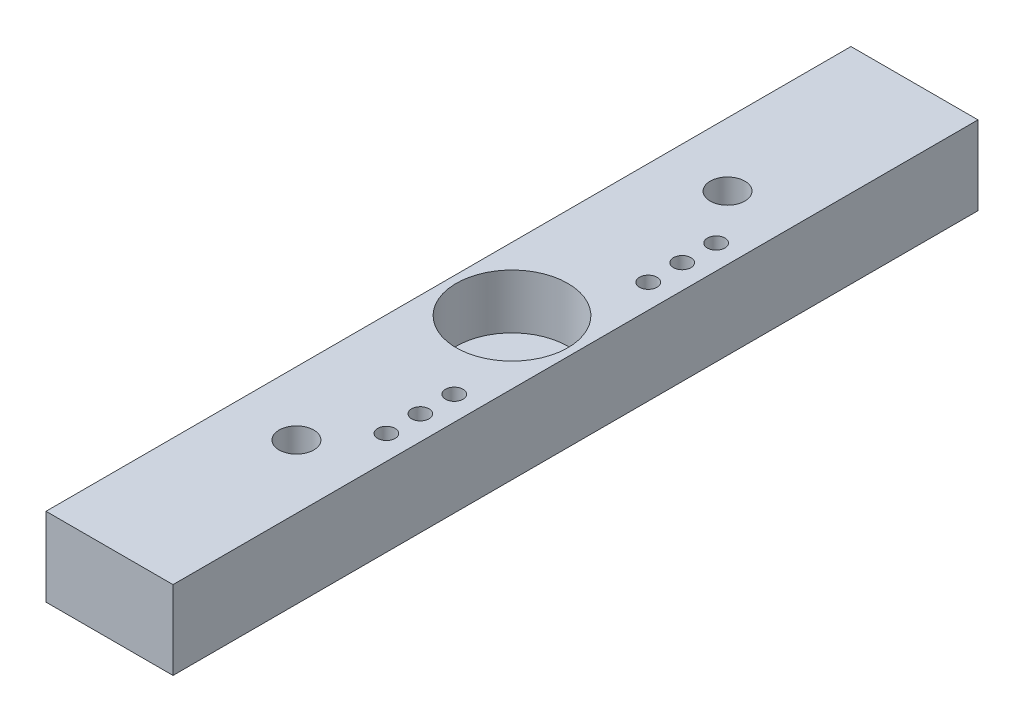
ISO-10303-21;
HEADER;
FILE_DESCRIPTION(('STEP AP214'),'2;1');
FILE_NAME('part.step','',(''),(''),'','','');
FILE_SCHEMA(('AUTOMOTIVE_DESIGN { 1 0 10303 214 1 1 1 1 }'));
ENDSEC;
DATA;
#1=APPLICATION_CONTEXT('core data for automotive mechanical design processes');
#2=APPLICATION_PROTOCOL_DEFINITION('international standard','automotive_design',2000,#1);
#3=PRODUCT_CONTEXT('',#1,'mechanical');
#4=PRODUCT('Part','Part','',(#3));
#5=PRODUCT_RELATED_PRODUCT_CATEGORY('part','',(#4));
#6=PRODUCT_DEFINITION_FORMATION('','',#4);
#7=PRODUCT_DEFINITION_CONTEXT('part definition',#1,'design');
#8=PRODUCT_DEFINITION('design','',#6,#7);
#9=PRODUCT_DEFINITION_SHAPE('','',#8);
#10=(LENGTH_UNIT() NAMED_UNIT(*) SI_UNIT(.MILLI.,.METRE.));
#11=(NAMED_UNIT(*) PLANE_ANGLE_UNIT() SI_UNIT($,.RADIAN.));
#12=(NAMED_UNIT(*) SI_UNIT($,.STERADIAN.) SOLID_ANGLE_UNIT());
#13=UNCERTAINTY_MEASURE_WITH_UNIT(LENGTH_MEASURE(1.E-05),#10,'distance_accuracy_value','');
#14=(GEOMETRIC_REPRESENTATION_CONTEXT(3) GLOBAL_UNCERTAINTY_ASSIGNED_CONTEXT((#13)) GLOBAL_UNIT_ASSIGNED_CONTEXT((#10,
#11,#12)) REPRESENTATION_CONTEXT('',''));
#15=CARTESIAN_POINT('',(0.,0.,0.));
#16=DIRECTION('',(0.,0.,1.));
#17=DIRECTION('',(1.,0.,0.));
#18=AXIS2_PLACEMENT_3D('',#15,#16,#17);
#19=CARTESIAN_POINT('',(0.,25.4,0.));
#20=DIRECTION('',(0.,-1.,0.));
#21=DIRECTION('',(0.,0.,-1.));
#22=AXIS2_PLACEMENT_3D('',#19,#20,#21);
#23=CYLINDRICAL_SURFACE('',#22,11.509375);
#24=CARTESIAN_POINT('',(0.,16.2291877167805,0.));
#25=DIRECTION('',(0.,-1.,0.));
#26=DIRECTION('',(1.,0.,0.));
#27=AXIS2_PLACEMENT_3D('',#24,#25,#26);
#28=CIRCLE('',#27,11.509375);
#29=CARTESIAN_POINT('',(0.,16.2291877167805,-11.509375));
#30=VERTEX_POINT('',#29);
#31=EDGE_CURVE('E102',#30,#30,#28,.F.);
#32=CARTESIAN_POINT('',(0.,5.,0.));
#33=DIRECTION('',(0.,-1.,0.));
#34=DIRECTION('',(0.,0.,-1.));
#35=AXIS2_PLACEMENT_3D('',#32,#33,#34);
#36=CIRCLE('',#35,11.509375);
#37=CARTESIAN_POINT('',(0.,5.,-11.509375));
#38=VERTEX_POINT('',#37);
#39=EDGE_CURVE('E157',#38,#38,#36,.T.);
#40=CARTESIAN_POINT('',(0.,16.2291877167805,-11.509375));
#41=CARTESIAN_POINT('',(0.,16.1122170113974,-11.509375));
#42=CARTESIAN_POINT('',(0.,15.9952463060142,-11.509375));
#43=CARTESIAN_POINT('',(0.,15.761304895248,-11.509375));
#44=CARTESIAN_POINT('',(0.,15.6443341898648,-11.509375));
#45=CARTESIAN_POINT('',(0.,15.4103927790986,-11.509375));
#46=CARTESIAN_POINT('',(0.,15.2934220737155,-11.509375));
#47=CARTESIAN_POINT('',(0.,15.0594806629492,-11.509375));
#48=CARTESIAN_POINT('',(0.,14.9425099575661,-11.509375));
#49=CARTESIAN_POINT('',(0.,14.7085685467998,-11.509375));
#50=CARTESIAN_POINT('',(0.,14.5915978414167,-11.509375));
#51=CARTESIAN_POINT('',(0.,14.3576564306504,-11.509375));
#52=CARTESIAN_POINT('',(0.,14.2406857252673,-11.509375));
#53=CARTESIAN_POINT('',(0.,14.006744314501,-11.509375));
#54=CARTESIAN_POINT('',(0.,13.8897736091179,-11.509375));
#55=CARTESIAN_POINT('',(0.,13.6558321983516,-11.509375));
#56=CARTESIAN_POINT('',(0.,13.5388614929685,-11.509375));
#57=CARTESIAN_POINT('',(0.,13.3049200822022,-11.509375));
#58=CARTESIAN_POINT('',(0.,13.1879493768191,-11.509375));
#59=CARTESIAN_POINT('',(0.,12.9540079660528,-11.509375));
#60=CARTESIAN_POINT('',(0.,12.8370372606697,-11.509375));
#61=CARTESIAN_POINT('',(0.,12.6030958499035,-11.509375));
#62=CARTESIAN_POINT('',(0.,12.4861251445203,-11.509375));
#63=CARTESIAN_POINT('',(0.,12.2521837337541,-11.509375));
#64=CARTESIAN_POINT('',(0.,12.1352130283709,-11.509375));
#65=CARTESIAN_POINT('',(0.,11.9012716176047,-11.509375));
#66=CARTESIAN_POINT('',(0.,11.7843009122215,-11.509375));
#67=CARTESIAN_POINT('',(0.,11.5503595014553,-11.509375));
#68=CARTESIAN_POINT('',(0.,11.4333887960722,-11.509375));
#69=CARTESIAN_POINT('',(0.,11.1994473853059,-11.509375));
#70=CARTESIAN_POINT('',(0.,11.0824766799228,-11.509375));
#71=CARTESIAN_POINT('',(0.,10.8485352691565,-11.509375));
#72=CARTESIAN_POINT('',(0.,10.7315645637734,-11.509375));
#73=CARTESIAN_POINT('',(0.,10.4976231530071,-11.509375));
#74=CARTESIAN_POINT('',(0.,10.380652447624,-11.509375));
#75=CARTESIAN_POINT('',(0.,10.1467110368577,-11.509375));
#76=CARTESIAN_POINT('',(0.,10.0297403314746,-11.509375));
#77=CARTESIAN_POINT('',(0.,9.79579892070833,-11.509375));
#78=CARTESIAN_POINT('',(0.,9.6788282153252,-11.509375));
#79=CARTESIAN_POINT('',(0.,9.44488680455894,-11.509375));
#80=CARTESIAN_POINT('',(0.,9.32791609917581,-11.509375));
#81=CARTESIAN_POINT('',(0.,9.09397468840955,-11.509375));
#82=CARTESIAN_POINT('',(0.,8.97700398302642,-11.509375));
#83=CARTESIAN_POINT('',(0.,8.74306257226016,-11.509375));
#84=CARTESIAN_POINT('',(0.,8.62609186687703,-11.509375));
#85=CARTESIAN_POINT('',(0.,8.39215045611077,-11.509375));
#86=CARTESIAN_POINT('',(0.,8.27517975072764,-11.509375));
#87=CARTESIAN_POINT('',(0.,8.04123833996138,-11.509375));
#88=CARTESIAN_POINT('',(0.,7.92426763457825,-11.509375));
#89=CARTESIAN_POINT('',(0.,7.69032622381199,-11.509375));
#90=CARTESIAN_POINT('',(0.,7.57335551842886,-11.509375));
#91=CARTESIAN_POINT('',(0.,7.3394141076626,-11.509375));
#92=CARTESIAN_POINT('',(0.,7.22244340227947,-11.509375));
#93=CARTESIAN_POINT('',(0.,6.98850199151321,-11.509375));
#94=CARTESIAN_POINT('',(0.,6.87153128613008,-11.509375));
#95=CARTESIAN_POINT('',(0.,6.63758987536382,-11.509375));
#96=CARTESIAN_POINT('',(0.,6.52061916998069,-11.509375));
#97=CARTESIAN_POINT('',(0.,6.28667775921443,-11.509375));
#98=CARTESIAN_POINT('',(0.,6.1697070538313,-11.509375));
#99=CARTESIAN_POINT('',(0.,5.93576564306504,-11.509375));
#100=CARTESIAN_POINT('',(0.,5.81879493768191,-11.509375));
#101=CARTESIAN_POINT('',(0.,5.58485352691565,-11.509375));
#102=CARTESIAN_POINT('',(0.,5.46788282153252,-11.509375));
#103=CARTESIAN_POINT('',(0.,5.23394141076626,-11.509375));
#104=CARTESIAN_POINT('',(0.,5.11697070538313,-11.509375));
#105=CARTESIAN_POINT('',(0.,5.,-11.509375));
#106=B_SPLINE_CURVE_WITH_KNOTS('',3,(#40,#41,#42,#43,#44,#45,#46,#47,#48,#49,#50,#51,#52,#53,
#54,#55,#56,#57,#58,#59,#60,#61,#62,#63,#64,#65,#66,#67,#68,#69,#70,#71,#72,#73,#74,#75,#76,#77,
#78,#79,#80,#81,#82,#83,#84,#85,#86,#87,#88,#89,#90,#91,#92,#93,#94,#95,#96,#97,#98,#99,#100,
#101,#102,#103,#104,#105),.UNSPECIFIED.,.F.,.F.,(4,2,2,2,2,2,2,2,2,2,2,2,2,2,2,2,2,2,2,2,2,2,2,
2,2,2,2,2,2,2,2,2,4),(0.,0.350912116149391,0.701824232298783,1.05273634844817,1.40364846459756,
1.75456058074695,2.10547269689634,2.45638481304574,2.80729692919513,3.15820904534452,
3.50912116149391,3.8600332776433,4.21094539379269,4.56185750994208,4.91276962609147,
5.26368174224086,5.61459385839025,5.96550597453964,6.31641809068903,6.66733020683842,
7.01824232298781,7.3691544391372,7.72006655528659,8.07097867143598,8.42189078758537,
8.77280290373476,9.12371501988415,9.47462713603355,9.82553925218294,10.1764513683323,
10.5273634844817,10.8782756006311,11.2291877167805),.UNSPECIFIED.);
#107=EDGE_CURVE('BSEAM35',#30,#38,#106,.T.);
#108=ORIENTED_EDGE('',*,*,#31,.T.);
#109=ORIENTED_EDGE('',*,*,#39,.T.);
#110=ORIENTED_EDGE('',*,*,#107,.T.);
#111=ORIENTED_EDGE('',*,*,#107,.F.);
#112=EDGE_LOOP('',(#108,#110,#109,#111));
#113=FACE_BOUND('',#112,.T.);
#114=ADVANCED_FACE('F35',(#113),#23,.F.);
#115=CARTESIAN_POINT('',(0.,25.4,-44.45));
#116=DIRECTION('',(0.,-1.,0.));
#117=DIRECTION('',(0.,0.,-1.));
#118=AXIS2_PLACEMENT_3D('',#115,#116,#117);
#119=CYLINDRICAL_SURFACE('',#118,3.571875);
#120=CARTESIAN_POINT('',(0.,16.2291877167805,-44.45));
#121=DIRECTION('',(0.,-1.,0.));
#122=DIRECTION('',(1.,0.,0.));
#123=AXIS2_PLACEMENT_3D('',#120,#121,#122);
#124=CIRCLE('',#123,3.571875);
#125=CARTESIAN_POINT('',(0.,16.2291877167805,-48.021875));
#126=VERTEX_POINT('',#125);
#127=EDGE_CURVE('E99',#126,#126,#124,.F.);
#128=CARTESIAN_POINT('',(0.,5.,-44.45));
#129=DIRECTION('',(0.,-1.,0.));
#130=DIRECTION('',(0.,0.,-1.));
#131=AXIS2_PLACEMENT_3D('',#128,#129,#130);
#132=CIRCLE('',#131,3.571875);
#133=CARTESIAN_POINT('',(0.,5.,-48.021875));
#134=VERTEX_POINT('',#133);
#135=EDGE_CURVE('E154',#134,#134,#132,.T.);
#136=CARTESIAN_POINT('',(0.,16.2291877167805,-48.021875));
#137=CARTESIAN_POINT('',(0.,16.1122170113974,-48.021875));
#138=CARTESIAN_POINT('',(0.,15.9952463060142,-48.021875));
#139=CARTESIAN_POINT('',(0.,15.761304895248,-48.021875));
#140=CARTESIAN_POINT('',(0.,15.6443341898648,-48.021875));
#141=CARTESIAN_POINT('',(0.,15.4103927790986,-48.021875));
#142=CARTESIAN_POINT('',(0.,15.2934220737155,-48.021875));
#143=CARTESIAN_POINT('',(0.,15.0594806629492,-48.021875));
#144=CARTESIAN_POINT('',(0.,14.9425099575661,-48.021875));
#145=CARTESIAN_POINT('',(0.,14.7085685467998,-48.021875));
#146=CARTESIAN_POINT('',(0.,14.5915978414167,-48.021875));
#147=CARTESIAN_POINT('',(0.,14.3576564306504,-48.021875));
#148=CARTESIAN_POINT('',(0.,14.2406857252673,-48.021875));
#149=CARTESIAN_POINT('',(0.,14.006744314501,-48.021875));
#150=CARTESIAN_POINT('',(0.,13.8897736091179,-48.021875));
#151=CARTESIAN_POINT('',(0.,13.6558321983516,-48.021875));
#152=CARTESIAN_POINT('',(0.,13.5388614929685,-48.021875));
#153=CARTESIAN_POINT('',(0.,13.3049200822022,-48.021875));
#154=CARTESIAN_POINT('',(0.,13.1879493768191,-48.021875));
#155=CARTESIAN_POINT('',(0.,12.9540079660528,-48.021875));
#156=CARTESIAN_POINT('',(0.,12.8370372606697,-48.021875));
#157=CARTESIAN_POINT('',(0.,12.6030958499035,-48.021875));
#158=CARTESIAN_POINT('',(0.,12.4861251445203,-48.021875));
#159=CARTESIAN_POINT('',(0.,12.2521837337541,-48.021875));
#160=CARTESIAN_POINT('',(0.,12.1352130283709,-48.021875));
#161=CARTESIAN_POINT('',(0.,11.9012716176047,-48.021875));
#162=CARTESIAN_POINT('',(0.,11.7843009122215,-48.021875));
#163=CARTESIAN_POINT('',(0.,11.5503595014553,-48.021875));
#164=CARTESIAN_POINT('',(0.,11.4333887960722,-48.021875));
#165=CARTESIAN_POINT('',(0.,11.1994473853059,-48.021875));
#166=CARTESIAN_POINT('',(0.,11.0824766799228,-48.021875));
#167=CARTESIAN_POINT('',(0.,10.8485352691565,-48.021875));
#168=CARTESIAN_POINT('',(0.,10.7315645637734,-48.021875));
#169=CARTESIAN_POINT('',(0.,10.4976231530071,-48.021875));
#170=CARTESIAN_POINT('',(0.,10.380652447624,-48.021875));
#171=CARTESIAN_POINT('',(0.,10.1467110368577,-48.021875));
#172=CARTESIAN_POINT('',(0.,10.0297403314746,-48.021875));
#173=CARTESIAN_POINT('',(0.,9.79579892070833,-48.021875));
#174=CARTESIAN_POINT('',(0.,9.6788282153252,-48.021875));
#175=CARTESIAN_POINT('',(0.,9.44488680455894,-48.021875));
#176=CARTESIAN_POINT('',(0.,9.32791609917581,-48.021875));
#177=CARTESIAN_POINT('',(0.,9.09397468840955,-48.021875));
#178=CARTESIAN_POINT('',(0.,8.97700398302642,-48.021875));
#179=CARTESIAN_POINT('',(0.,8.74306257226016,-48.021875));
#180=CARTESIAN_POINT('',(0.,8.62609186687703,-48.021875));
#181=CARTESIAN_POINT('',(0.,8.39215045611077,-48.021875));
#182=CARTESIAN_POINT('',(0.,8.27517975072764,-48.021875));
#183=CARTESIAN_POINT('',(0.,8.04123833996138,-48.021875));
#184=CARTESIAN_POINT('',(0.,7.92426763457825,-48.021875));
#185=CARTESIAN_POINT('',(0.,7.69032622381199,-48.021875));
#186=CARTESIAN_POINT('',(0.,7.57335551842886,-48.021875));
#187=CARTESIAN_POINT('',(0.,7.3394141076626,-48.021875));
#188=CARTESIAN_POINT('',(0.,7.22244340227947,-48.021875));
#189=CARTESIAN_POINT('',(0.,6.98850199151321,-48.021875));
#190=CARTESIAN_POINT('',(0.,6.87153128613008,-48.021875));
#191=CARTESIAN_POINT('',(0.,6.63758987536382,-48.021875));
#192=CARTESIAN_POINT('',(0.,6.52061916998069,-48.021875));
#193=CARTESIAN_POINT('',(0.,6.28667775921443,-48.021875));
#194=CARTESIAN_POINT('',(0.,6.1697070538313,-48.021875));
#195=CARTESIAN_POINT('',(0.,5.93576564306504,-48.021875));
#196=CARTESIAN_POINT('',(0.,5.81879493768191,-48.021875));
#197=CARTESIAN_POINT('',(0.,5.58485352691565,-48.021875));
#198=CARTESIAN_POINT('',(0.,5.46788282153252,-48.021875));
#199=CARTESIAN_POINT('',(0.,5.23394141076626,-48.021875));
#200=CARTESIAN_POINT('',(0.,5.11697070538313,-48.021875));
#201=CARTESIAN_POINT('',(0.,5.,-48.021875));
#202=B_SPLINE_CURVE_WITH_KNOTS('',3,(#136,#137,#138,#139,#140,#141,#142,#143,#144,#145,#146,
#147,#148,#149,#150,#151,#152,#153,#154,#155,#156,#157,#158,#159,#160,#161,#162,#163,#164,#165,
#166,#167,#168,#169,#170,#171,#172,#173,#174,#175,#176,#177,#178,#179,#180,#181,#182,#183,#184,
#185,#186,#187,#188,#189,#190,#191,#192,#193,#194,#195,#196,#197,#198,#199,#200,#201),
.UNSPECIFIED.,.F.,.F.,(4,2,2,2,2,2,2,2,2,2,2,2,2,2,2,2,2,2,2,2,2,2,2,2,2,2,2,2,2,2,2,2,4),(0.,
0.350912116149391,0.701824232298783,1.05273634844817,1.40364846459756,1.75456058074695,
2.10547269689634,2.45638481304574,2.80729692919513,3.15820904534452,3.50912116149391,
3.8600332776433,4.21094539379269,4.56185750994208,4.91276962609147,5.26368174224086,
5.61459385839025,5.96550597453964,6.31641809068903,6.66733020683842,7.01824232298781,
7.3691544391372,7.72006655528659,8.07097867143598,8.42189078758537,8.77280290373476,
9.12371501988415,9.47462713603355,9.82553925218294,10.1764513683323,10.5273634844817,
10.8782756006311,11.2291877167805),.UNSPECIFIED.);
#203=EDGE_CURVE('BSEAM173',#126,#134,#202,.T.);
#204=ORIENTED_EDGE('',*,*,#127,.T.);
#205=ORIENTED_EDGE('',*,*,#135,.T.);
#206=ORIENTED_EDGE('',*,*,#203,.T.);
#207=ORIENTED_EDGE('',*,*,#203,.F.);
#208=EDGE_LOOP('',(#204,#206,#205,#207));
#209=FACE_BOUND('',#208,.T.);
#210=ADVANCED_FACE('F173',(#209),#119,.F.);
#211=CARTESIAN_POINT('',(0.,25.4,44.45));
#212=DIRECTION('',(0.,-1.,0.));
#213=DIRECTION('',(0.,0.,-1.));
#214=AXIS2_PLACEMENT_3D('',#211,#212,#213);
#215=CYLINDRICAL_SURFACE('',#214,3.571875);
#216=CARTESIAN_POINT('',(0.,16.2291877167805,44.45));
#217=DIRECTION('',(0.,-1.,0.));
#218=DIRECTION('',(1.,0.,0.));
#219=AXIS2_PLACEMENT_3D('',#216,#217,#218);
#220=CIRCLE('',#219,3.571875);
#221=CARTESIAN_POINT('',(0.,16.2291877167805,40.878125));
#222=VERTEX_POINT('',#221);
#223=EDGE_CURVE('E96',#222,#222,#220,.F.);
#224=CARTESIAN_POINT('',(0.,5.,44.45));
#225=DIRECTION('',(0.,-1.,0.));
#226=DIRECTION('',(0.,0.,-1.));
#227=AXIS2_PLACEMENT_3D('',#224,#225,#226);
#228=CIRCLE('',#227,3.571875);
#229=CARTESIAN_POINT('',(0.,5.,40.878125));
#230=VERTEX_POINT('',#229);
#231=EDGE_CURVE('E143',#230,#230,#228,.T.);
#232=CARTESIAN_POINT('',(0.,16.2291877167805,40.878125));
#233=CARTESIAN_POINT('',(0.,16.1122170113974,40.878125));
#234=CARTESIAN_POINT('',(0.,15.9952463060142,40.878125));
#235=CARTESIAN_POINT('',(0.,15.761304895248,40.878125));
#236=CARTESIAN_POINT('',(0.,15.6443341898648,40.878125));
#237=CARTESIAN_POINT('',(0.,15.4103927790986,40.878125));
#238=CARTESIAN_POINT('',(0.,15.2934220737155,40.878125));
#239=CARTESIAN_POINT('',(0.,15.0594806629492,40.878125));
#240=CARTESIAN_POINT('',(0.,14.9425099575661,40.878125));
#241=CARTESIAN_POINT('',(0.,14.7085685467998,40.878125));
#242=CARTESIAN_POINT('',(0.,14.5915978414167,40.878125));
#243=CARTESIAN_POINT('',(0.,14.3576564306504,40.878125));
#244=CARTESIAN_POINT('',(0.,14.2406857252673,40.878125));
#245=CARTESIAN_POINT('',(0.,14.006744314501,40.878125));
#246=CARTESIAN_POINT('',(0.,13.8897736091179,40.878125));
#247=CARTESIAN_POINT('',(0.,13.6558321983516,40.878125));
#248=CARTESIAN_POINT('',(0.,13.5388614929685,40.878125));
#249=CARTESIAN_POINT('',(0.,13.3049200822022,40.878125));
#250=CARTESIAN_POINT('',(0.,13.1879493768191,40.878125));
#251=CARTESIAN_POINT('',(0.,12.9540079660528,40.878125));
#252=CARTESIAN_POINT('',(0.,12.8370372606697,40.878125));
#253=CARTESIAN_POINT('',(0.,12.6030958499035,40.878125));
#254=CARTESIAN_POINT('',(0.,12.4861251445203,40.878125));
#255=CARTESIAN_POINT('',(0.,12.2521837337541,40.878125));
#256=CARTESIAN_POINT('',(0.,12.1352130283709,40.878125));
#257=CARTESIAN_POINT('',(0.,11.9012716176047,40.878125));
#258=CARTESIAN_POINT('',(0.,11.7843009122215,40.878125));
#259=CARTESIAN_POINT('',(0.,11.5503595014553,40.878125));
#260=CARTESIAN_POINT('',(0.,11.4333887960722,40.878125));
#261=CARTESIAN_POINT('',(0.,11.1994473853059,40.878125));
#262=CARTESIAN_POINT('',(0.,11.0824766799228,40.878125));
#263=CARTESIAN_POINT('',(0.,10.8485352691565,40.878125));
#264=CARTESIAN_POINT('',(0.,10.7315645637734,40.878125));
#265=CARTESIAN_POINT('',(0.,10.4976231530071,40.878125));
#266=CARTESIAN_POINT('',(0.,10.380652447624,40.878125));
#267=CARTESIAN_POINT('',(0.,10.1467110368577,40.878125));
#268=CARTESIAN_POINT('',(0.,10.0297403314746,40.878125));
#269=CARTESIAN_POINT('',(0.,9.79579892070833,40.878125));
#270=CARTESIAN_POINT('',(0.,9.6788282153252,40.878125));
#271=CARTESIAN_POINT('',(0.,9.44488680455894,40.878125));
#272=CARTESIAN_POINT('',(0.,9.32791609917581,40.878125));
#273=CARTESIAN_POINT('',(0.,9.09397468840955,40.878125));
#274=CARTESIAN_POINT('',(0.,8.97700398302642,40.878125));
#275=CARTESIAN_POINT('',(0.,8.74306257226016,40.878125));
#276=CARTESIAN_POINT('',(0.,8.62609186687703,40.878125));
#277=CARTESIAN_POINT('',(0.,8.39215045611077,40.878125));
#278=CARTESIAN_POINT('',(0.,8.27517975072764,40.878125));
#279=CARTESIAN_POINT('',(0.,8.04123833996138,40.878125));
#280=CARTESIAN_POINT('',(0.,7.92426763457825,40.878125));
#281=CARTESIAN_POINT('',(0.,7.69032622381199,40.878125));
#282=CARTESIAN_POINT('',(0.,7.57335551842886,40.878125));
#283=CARTESIAN_POINT('',(0.,7.3394141076626,40.878125));
#284=CARTESIAN_POINT('',(0.,7.22244340227947,40.878125));
#285=CARTESIAN_POINT('',(0.,6.98850199151321,40.878125));
#286=CARTESIAN_POINT('',(0.,6.87153128613008,40.878125));
#287=CARTESIAN_POINT('',(0.,6.63758987536382,40.878125));
#288=CARTESIAN_POINT('',(0.,6.52061916998069,40.878125));
#289=CARTESIAN_POINT('',(0.,6.28667775921443,40.878125));
#290=CARTESIAN_POINT('',(0.,6.1697070538313,40.878125));
#291=CARTESIAN_POINT('',(0.,5.93576564306504,40.878125));
#292=CARTESIAN_POINT('',(0.,5.81879493768191,40.878125));
#293=CARTESIAN_POINT('',(0.,5.58485352691565,40.878125));
#294=CARTESIAN_POINT('',(0.,5.46788282153252,40.878125));
#295=CARTESIAN_POINT('',(0.,5.23394141076626,40.878125));
#296=CARTESIAN_POINT('',(0.,5.11697070538313,40.878125));
#297=CARTESIAN_POINT('',(0.,5.,40.878125));
#298=B_SPLINE_CURVE_WITH_KNOTS('',3,(#232,#233,#234,#235,#236,#237,#238,#239,#240,#241,#242,
#243,#244,#245,#246,#247,#248,#249,#250,#251,#252,#253,#254,#255,#256,#257,#258,#259,#260,#261,
#262,#263,#264,#265,#266,#267,#268,#269,#270,#271,#272,#273,#274,#275,#276,#277,#278,#279,#280,
#281,#282,#283,#284,#285,#286,#287,#288,#289,#290,#291,#292,#293,#294,#295,#296,#297),
.UNSPECIFIED.,.F.,.F.,(4,2,2,2,2,2,2,2,2,2,2,2,2,2,2,2,2,2,2,2,2,2,2,2,2,2,2,2,2,2,2,2,4),(0.,
0.350912116149391,0.701824232298783,1.05273634844817,1.40364846459756,1.75456058074695,
2.10547269689634,2.45638481304574,2.80729692919513,3.15820904534452,3.50912116149391,
3.8600332776433,4.21094539379269,4.56185750994208,4.91276962609147,5.26368174224086,
5.61459385839025,5.96550597453964,6.31641809068903,6.66733020683842,7.01824232298781,
7.3691544391372,7.72006655528659,8.07097867143598,8.42189078758537,8.77280290373476,
9.12371501988415,9.47462713603355,9.82553925218294,10.1764513683323,10.5273634844817,
10.8782756006311,11.2291877167805),.UNSPECIFIED.);
#299=EDGE_CURVE('BSEAM178',#222,#230,#298,.T.);
#300=ORIENTED_EDGE('',*,*,#223,.T.);
#301=ORIENTED_EDGE('',*,*,#231,.T.);
#302=ORIENTED_EDGE('',*,*,#299,.T.);
#303=ORIENTED_EDGE('',*,*,#299,.F.);
#304=EDGE_LOOP('',(#300,#302,#301,#303));
#305=FACE_BOUND('',#304,.T.);
#306=ADVANCED_FACE('F178',(#305),#215,.F.);
#307=CARTESIAN_POINT('',(0.,25.4,83.0000000000001));
#308=DIRECTION('',(0.,0.,1.));
#309=DIRECTION('',(1.,0.,0.));
#310=AXIS2_PLACEMENT_3D('',#307,#308,#309);
#311=PLANE('',#310);
#312=DIRECTION('',(0.,1.,0.));
#313=VECTOR('',#312,1.);
#314=CARTESIAN_POINT('',(-13.096875,-0.001000000000001,83.0000000000001));
#315=LINE('',#314,#313);
#316=CARTESIAN_POINT('',(-13.096875,0.,83.0000000000001));
#317=VERTEX_POINT('',#316);
#318=CARTESIAN_POINT('',(-13.096875,16.2291877167805,83.0000000000001));
#319=VERTEX_POINT('',#318);
#320=EDGE_CURVE('E49',#317,#319,#315,.T.);
#321=ORIENTED_EDGE('',*,*,#320,.F.);
#322=DIRECTION('',(-1.,0.,0.));
#323=VECTOR('',#322,1.);
#324=CARTESIAN_POINT('',(0.,0.,83.0000000000001));
#325=LINE('',#324,#323);
#326=CARTESIAN_POINT('',(13.096875,0.,83.0000000000001));
#327=VERTEX_POINT('',#326);
#328=EDGE_CURVE('E42',#327,#317,#325,.T.);
#329=ORIENTED_EDGE('',*,*,#328,.F.);
#330=DIRECTION('',(0.,1.,0.));
#331=VECTOR('',#330,1.);
#332=CARTESIAN_POINT('',(13.096875,-0.001000000000001,83.0000000000001));
#333=LINE('',#332,#331);
#334=CARTESIAN_POINT('',(13.096875,16.2291877167805,83.0000000000001));
#335=VERTEX_POINT('',#334);
#336=EDGE_CURVE('E139',#327,#335,#333,.T.);
#337=ORIENTED_EDGE('',*,*,#336,.T.);
#338=DIRECTION('',(-1.,0.,0.));
#339=VECTOR('',#338,1.);
#340=CARTESIAN_POINT('',(-19.0500000000001,16.2291877167805,83.0000000000001));
#341=LINE('',#340,#339);
#342=EDGE_CURVE('E88',#335,#319,#341,.T.);
#343=ORIENTED_EDGE('',*,*,#342,.T.);
#344=EDGE_LOOP('',(#321,#329,#337,#343));
#345=FACE_BOUND('',#344,.T.);
#346=ADVANCED_FACE('F85',(#345),#311,.T.);
#347=CARTESIAN_POINT('',(0.,25.4,-82.9999999999999));
#348=DIRECTION('',(0.,0.,-1.));
#349=DIRECTION('',(-1.,0.,0.));
#350=AXIS2_PLACEMENT_3D('',#347,#348,#349);
#351=PLANE('',#350);
#352=DIRECTION('',(0.,1.,0.));
#353=VECTOR('',#352,1.);
#354=CARTESIAN_POINT('',(-13.096875,-0.001000000000001,-82.9999999999999));
#355=LINE('',#354,#353);
#356=CARTESIAN_POINT('',(-13.096875,0.,-82.9999999999999));
#357=VERTEX_POINT('',#356);
#358=CARTESIAN_POINT('',(-13.096875,16.2291877167805,-82.9999999999999));
#359=VERTEX_POINT('',#358);
#360=EDGE_CURVE('E76',#357,#359,#355,.T.);
#361=ORIENTED_EDGE('',*,*,#360,.T.);
#362=DIRECTION('',(-1.,0.,0.));
#363=VECTOR('',#362,1.);
#364=CARTESIAN_POINT('',(-19.05,16.2291877167805,-82.9999999999999));
#365=LINE('',#364,#363);
#366=CARTESIAN_POINT('',(13.096875,16.2291877167805,-82.9999999999999));
#367=VERTEX_POINT('',#366);
#368=EDGE_CURVE('E93',#367,#359,#365,.T.);
#369=ORIENTED_EDGE('',*,*,#368,.F.);
#370=DIRECTION('',(0.,1.,0.));
#371=VECTOR('',#370,1.);
#372=CARTESIAN_POINT('',(13.096875,-0.001000000000001,-82.9999999999999));
#373=LINE('',#372,#371);
#374=CARTESIAN_POINT('',(13.096875,0.,-82.9999999999999));
#375=VERTEX_POINT('',#374);
#376=EDGE_CURVE('E57',#375,#367,#373,.T.);
#377=ORIENTED_EDGE('',*,*,#376,.F.);
#378=DIRECTION('',(1.,0.,0.));
#379=VECTOR('',#378,1.);
#380=CARTESIAN_POINT('',(0.,0.,-82.9999999999999));
#381=LINE('',#380,#379);
#382=EDGE_CURVE('E11',#357,#375,#381,.T.);
#383=ORIENTED_EDGE('',*,*,#382,.F.);
#384=EDGE_LOOP('',(#361,#369,#377,#383));
#385=FACE_BOUND('',#384,.T.);
#386=ADVANCED_FACE('F196',(#385),#351,.T.);
#387=CARTESIAN_POINT('',(0.,0.,0.));
#388=DIRECTION('',(0.,1.,0.));
#389=DIRECTION('',(0.,0.,1.));
#390=AXIS2_PLACEMENT_3D('',#387,#388,#389);
#391=PLANE('',#390);
#392=CARTESIAN_POINT('',(8.09687500000001,0.,27.));
#393=DIRECTION('',(0.,1.,0.));
#394=DIRECTION('',(0.,0.,1.));
#395=AXIS2_PLACEMENT_3D('',#392,#393,#394);
#396=CIRCLE('',#395,1.8);
#397=CARTESIAN_POINT('',(8.09687500000001,0.,28.8));
#398=VERTEX_POINT('',#397);
#399=EDGE_CURVE('E113',#398,#398,#396,.F.);
#400=ORIENTED_EDGE('',*,*,#399,.F.);
#401=EDGE_LOOP('',(#400));
#402=FACE_BOUND('',#401,.T.);
#403=CARTESIAN_POINT('',(8.09687500000001,0.,20.));
#404=DIRECTION('',(0.,1.,0.));
#405=DIRECTION('',(0.,0.,1.));
#406=AXIS2_PLACEMENT_3D('',#403,#404,#405);
#407=CIRCLE('',#406,1.8);
#408=CARTESIAN_POINT('',(8.09687500000001,0.,21.8));
#409=VERTEX_POINT('',#408);
#410=EDGE_CURVE('E128',#409,#409,#407,.F.);
#411=ORIENTED_EDGE('',*,*,#410,.F.);
#412=EDGE_LOOP('',(#411));
#413=FACE_BOUND('',#412,.T.);
#414=CARTESIAN_POINT('',(8.09687499999999,0.,-20.));
#415=DIRECTION('',(0.,1.,0.));
#416=DIRECTION('',(0.,0.,1.));
#417=AXIS2_PLACEMENT_3D('',#414,#415,#416);
#418=CIRCLE('',#417,1.8);
#419=CARTESIAN_POINT('',(8.09687499999999,0.,-18.2));
#420=VERTEX_POINT('',#419);
#421=EDGE_CURVE('E122',#420,#420,#418,.F.);
#422=ORIENTED_EDGE('',*,*,#421,.F.);
#423=EDGE_LOOP('',(#422));
#424=FACE_BOUND('',#423,.T.);
#425=CARTESIAN_POINT('',(8.09687499999999,0.,-27.));
#426=DIRECTION('',(0.,1.,0.));
#427=DIRECTION('',(0.,0.,1.));
#428=AXIS2_PLACEMENT_3D('',#425,#426,#427);
#429=CIRCLE('',#428,1.8);
#430=CARTESIAN_POINT('',(8.09687499999999,0.,-25.2));
#431=VERTEX_POINT('',#430);
#432=EDGE_CURVE('E114',#431,#431,#429,.F.);
#433=ORIENTED_EDGE('',*,*,#432,.F.);
#434=EDGE_LOOP('',(#433));
#435=FACE_BOUND('',#434,.T.);
#436=CARTESIAN_POINT('',(8.09687499999999,0.,-34.));
#437=DIRECTION('',(0.,1.,0.));
#438=DIRECTION('',(0.,0.,1.));
#439=AXIS2_PLACEMENT_3D('',#436,#437,#438);
#440=CIRCLE('',#439,1.8);
#441=CARTESIAN_POINT('',(8.09687499999999,0.,-32.2));
#442=VERTEX_POINT('',#441);
#443=EDGE_CURVE('E121',#442,#442,#440,.F.);
#444=ORIENTED_EDGE('',*,*,#443,.F.);
#445=EDGE_LOOP('',(#444));
#446=FACE_BOUND('',#445,.T.);
#447=CARTESIAN_POINT('',(8.09687500000001,0.,34.));
#448=DIRECTION('',(0.,1.,0.));
#449=DIRECTION('',(0.,0.,1.));
#450=AXIS2_PLACEMENT_3D('',#447,#448,#449);
#451=CIRCLE('',#450,1.8);
#452=CARTESIAN_POINT('',(8.09687500000001,0.,35.8));
#453=VERTEX_POINT('',#452);
#454=EDGE_CURVE('E105',#453,#453,#451,.F.);
#455=ORIENTED_EDGE('',*,*,#454,.F.);
#456=EDGE_LOOP('',(#455));
#457=FACE_BOUND('',#456,.T.);
#458=ORIENTED_EDGE('',*,*,#328,.T.);
#459=DIRECTION('',(0.,0.,1.));
#460=VECTOR('',#459,1.);
#461=CARTESIAN_POINT('',(-13.096875,0.,0.));
#462=LINE('',#461,#460);
#463=EDGE_CURVE('E73',#357,#317,#462,.T.);
#464=ORIENTED_EDGE('',*,*,#463,.F.);
#465=ORIENTED_EDGE('',*,*,#382,.T.);
#466=DIRECTION('',(0.,0.,1.));
#467=VECTOR('',#466,1.);
#468=CARTESIAN_POINT('',(13.096875,0.,0.));
#469=LINE('',#468,#467);
#470=EDGE_CURVE('E92',#375,#327,#469,.T.);
#471=ORIENTED_EDGE('',*,*,#470,.T.);
#472=EDGE_LOOP('',(#458,#464,#465,#471));
#473=FACE_BOUND('',#472,.T.);
#474=ADVANCED_FACE('F91',(#402,#413,#424,#435,#446,#457,#473),#391,.F.);
#475=CARTESIAN_POINT('',(-19.0500000000001,16.2291877167805,83.0010000000001));
#476=DIRECTION('',(0.,-1.,0.));
#477=DIRECTION('',(1.,0.,0.));
#478=AXIS2_PLACEMENT_3D('',#475,#476,#477);
#479=PLANE('',#478);
#480=CARTESIAN_POINT('',(8.09687500000001,16.2291877167805,27.));
#481=DIRECTION('',(0.,-1.,0.));
#482=DIRECTION('',(1.,0.,0.));
#483=AXIS2_PLACEMENT_3D('',#480,#481,#482);
#484=CIRCLE('',#483,1.8);
#485=CARTESIAN_POINT('',(9.89687500000001,16.2291877167805,27.));
#486=VERTEX_POINT('',#485);
#487=EDGE_CURVE('E131',#486,#486,#484,.F.);
#488=ORIENTED_EDGE('',*,*,#487,.F.);
#489=EDGE_LOOP('',(#488));
#490=FACE_BOUND('',#489,.T.);
#491=CARTESIAN_POINT('',(8.09687500000001,16.2291877167805,20.));
#492=DIRECTION('',(0.,-1.,0.));
#493=DIRECTION('',(1.,0.,0.));
#494=AXIS2_PLACEMENT_3D('',#491,#492,#493);
#495=CIRCLE('',#494,1.8);
#496=CARTESIAN_POINT('',(9.89687500000001,16.2291877167805,20.));
#497=VERTEX_POINT('',#496);
#498=EDGE_CURVE('E125',#497,#497,#495,.F.);
#499=ORIENTED_EDGE('',*,*,#498,.F.);
#500=EDGE_LOOP('',(#499));
#501=FACE_BOUND('',#500,.T.);
#502=CARTESIAN_POINT('',(8.09687499999999,16.2291877167805,-20.));
#503=DIRECTION('',(0.,-1.,0.));
#504=DIRECTION('',(1.,0.,0.));
#505=AXIS2_PLACEMENT_3D('',#502,#503,#504);
#506=CIRCLE('',#505,1.8);
#507=CARTESIAN_POINT('',(9.89687499999999,16.2291877167805,-20.));
#508=VERTEX_POINT('',#507);
#509=EDGE_CURVE('E117',#508,#508,#506,.F.);
#510=ORIENTED_EDGE('',*,*,#509,.F.);
#511=EDGE_LOOP('',(#510));
#512=FACE_BOUND('',#511,.T.);
#513=CARTESIAN_POINT('',(8.09687499999999,16.2291877167805,-27.));
#514=DIRECTION('',(0.,-1.,0.));
#515=DIRECTION('',(1.,0.,0.));
#516=AXIS2_PLACEMENT_3D('',#513,#514,#515);
#517=CIRCLE('',#516,1.8);
#518=CARTESIAN_POINT('',(9.89687499999999,16.2291877167805,-27.));
#519=VERTEX_POINT('',#518);
#520=EDGE_CURVE('E118',#519,#519,#517,.F.);
#521=ORIENTED_EDGE('',*,*,#520,.F.);
#522=EDGE_LOOP('',(#521));
#523=FACE_BOUND('',#522,.T.);
#524=CARTESIAN_POINT('',(8.09687499999999,16.2291877167805,-34.));
#525=DIRECTION('',(0.,-1.,0.));
#526=DIRECTION('',(1.,0.,0.));
#527=AXIS2_PLACEMENT_3D('',#524,#525,#526);
#528=CIRCLE('',#527,1.8);
#529=CARTESIAN_POINT('',(9.89687499999999,16.2291877167805,-34.));
#530=VERTEX_POINT('',#529);
#531=EDGE_CURVE('E145',#530,#530,#528,.F.);
#532=ORIENTED_EDGE('',*,*,#531,.F.);
#533=EDGE_LOOP('',(#532));
#534=FACE_BOUND('',#533,.T.);
#535=ORIENTED_EDGE('',*,*,#31,.F.);
#536=EDGE_LOOP('',(#535));
#537=FACE_BOUND('',#536,.T.);
#538=ORIENTED_EDGE('',*,*,#127,.F.);
#539=EDGE_LOOP('',(#538));
#540=FACE_BOUND('',#539,.T.);
#541=ORIENTED_EDGE('',*,*,#223,.F.);
#542=EDGE_LOOP('',(#541));
#543=FACE_BOUND('',#542,.T.);
#544=CARTESIAN_POINT('',(8.09687500000001,16.2291877167805,34.));
#545=DIRECTION('',(0.,-1.,0.));
#546=DIRECTION('',(1.,0.,0.));
#547=AXIS2_PLACEMENT_3D('',#544,#545,#546);
#548=CIRCLE('',#547,1.8);
#549=CARTESIAN_POINT('',(9.89687500000001,16.2291877167805,34.));
#550=VERTEX_POINT('',#549);
#551=EDGE_CURVE('E110',#550,#550,#548,.F.);
#552=ORIENTED_EDGE('',*,*,#551,.F.);
#553=EDGE_LOOP('',(#552));
#554=FACE_BOUND('',#553,.T.);
#555=ORIENTED_EDGE('',*,*,#368,.T.);
#556=DIRECTION('',(0.,0.,-1.));
#557=VECTOR('',#556,1.);
#558=CARTESIAN_POINT('',(-13.096875,16.2291877167805,0.));
#559=LINE('',#558,#557);
#560=EDGE_CURVE('E80',#319,#359,#559,.T.);
#561=ORIENTED_EDGE('',*,*,#560,.F.);
#562=ORIENTED_EDGE('',*,*,#342,.F.);
#563=DIRECTION('',(0.,0.,-1.));
#564=VECTOR('',#563,1.);
#565=CARTESIAN_POINT('',(13.096875,16.2291877167805,0.));
#566=LINE('',#565,#564);
#567=EDGE_CURVE('E142',#335,#367,#566,.T.);
#568=ORIENTED_EDGE('',*,*,#567,.T.);
#569=EDGE_LOOP('',(#555,#561,#562,#568));
#570=FACE_BOUND('',#569,.T.);
#571=ADVANCED_FACE('F182',(#490,#501,#512,#523,#534,#537,#540,#543,#554,#570),#479,.F.);
#572=CARTESIAN_POINT('',(8.09687500000001,-0.001000000000001,34.));
#573=DIRECTION('',(0.,1.,0.));
#574=DIRECTION('',(0.,0.,1.));
#575=AXIS2_PLACEMENT_3D('',#572,#573,#574);
#576=CYLINDRICAL_SURFACE('',#575,1.8);
#577=ORIENTED_EDGE('',*,*,#551,.T.);
#578=EDGE_LOOP('',(#577));
#579=FACE_BOUND('',#578,.T.);
#580=ORIENTED_EDGE('',*,*,#454,.T.);
#581=EDGE_LOOP('',(#580));
#582=FACE_BOUND('',#581,.T.);
#583=ADVANCED_FACE('F185',(#579,#582),#576,.F.);
#584=CARTESIAN_POINT('',(13.096875,-0.001000000000001,0.));
#585=DIRECTION('',(1.,0.,0.));
#586=DIRECTION('',(0.,0.,-1.));
#587=AXIS2_PLACEMENT_3D('',#584,#585,#586);
#588=PLANE('',#587);
#589=ORIENTED_EDGE('',*,*,#376,.T.);
#590=ORIENTED_EDGE('',*,*,#567,.F.);
#591=ORIENTED_EDGE('',*,*,#336,.F.);
#592=ORIENTED_EDGE('',*,*,#470,.F.);
#593=EDGE_LOOP('',(#589,#590,#591,#592));
#594=FACE_BOUND('',#593,.T.);
#595=ADVANCED_FACE('F231',(#594),#588,.T.);
#596=CARTESIAN_POINT('',(-13.096875,-0.001000000000001,0.));
#597=DIRECTION('',(1.,0.,0.));
#598=DIRECTION('',(0.,0.,-1.));
#599=AXIS2_PLACEMENT_3D('',#596,#597,#598);
#600=PLANE('',#599);
#601=ORIENTED_EDGE('',*,*,#463,.T.);
#602=ORIENTED_EDGE('',*,*,#320,.T.);
#603=ORIENTED_EDGE('',*,*,#560,.T.);
#604=ORIENTED_EDGE('',*,*,#360,.F.);
#605=EDGE_LOOP('',(#601,#602,#603,#604));
#606=FACE_BOUND('',#605,.T.);
#607=ADVANCED_FACE('F74',(#606),#600,.F.);
#608=CARTESIAN_POINT('',(8.09687499999999,-0.001000000000001,-34.));
#609=DIRECTION('',(0.,1.,0.));
#610=DIRECTION('',(0.,0.,1.));
#611=AXIS2_PLACEMENT_3D('',#608,#609,#610);
#612=CYLINDRICAL_SURFACE('',#611,1.8);
#613=ORIENTED_EDGE('',*,*,#531,.T.);
#614=EDGE_LOOP('',(#613));
#615=FACE_BOUND('',#614,.T.);
#616=ORIENTED_EDGE('',*,*,#443,.T.);
#617=EDGE_LOOP('',(#616));
#618=FACE_BOUND('',#617,.T.);
#619=ADVANCED_FACE('F224',(#615,#618),#612,.F.);
#620=CARTESIAN_POINT('',(8.09687499999999,-0.001000000000001,-27.));
#621=DIRECTION('',(0.,1.,0.));
#622=DIRECTION('',(0.,0.,1.));
#623=AXIS2_PLACEMENT_3D('',#620,#621,#622);
#624=CYLINDRICAL_SURFACE('',#623,1.8);
#625=ORIENTED_EDGE('',*,*,#520,.T.);
#626=EDGE_LOOP('',(#625));
#627=FACE_BOUND('',#626,.T.);
#628=ORIENTED_EDGE('',*,*,#432,.T.);
#629=EDGE_LOOP('',(#628));
#630=FACE_BOUND('',#629,.T.);
#631=ADVANCED_FACE('F227',(#627,#630),#624,.F.);
#632=CARTESIAN_POINT('',(8.09687499999999,-0.001000000000001,-20.));
#633=DIRECTION('',(0.,1.,0.));
#634=DIRECTION('',(0.,0.,1.));
#635=AXIS2_PLACEMENT_3D('',#632,#633,#634);
#636=CYLINDRICAL_SURFACE('',#635,1.8);
#637=ORIENTED_EDGE('',*,*,#509,.T.);
#638=EDGE_LOOP('',(#637));
#639=FACE_BOUND('',#638,.T.);
#640=ORIENTED_EDGE('',*,*,#421,.T.);
#641=EDGE_LOOP('',(#640));
#642=FACE_BOUND('',#641,.T.);
#643=ADVANCED_FACE('F236',(#639,#642),#636,.F.);
#644=CARTESIAN_POINT('',(8.09687500000001,-0.001000000000001,20.));
#645=DIRECTION('',(0.,1.,0.));
#646=DIRECTION('',(0.,0.,1.));
#647=AXIS2_PLACEMENT_3D('',#644,#645,#646);
#648=CYLINDRICAL_SURFACE('',#647,1.8);
#649=ORIENTED_EDGE('',*,*,#498,.T.);
#650=EDGE_LOOP('',(#649));
#651=FACE_BOUND('',#650,.T.);
#652=ORIENTED_EDGE('',*,*,#410,.T.);
#653=EDGE_LOOP('',(#652));
#654=FACE_BOUND('',#653,.T.);
#655=ADVANCED_FACE('F220',(#651,#654),#648,.F.);
#656=CARTESIAN_POINT('',(8.09687500000001,-0.001000000000001,27.));
#657=DIRECTION('',(0.,1.,0.));
#658=DIRECTION('',(0.,0.,1.));
#659=AXIS2_PLACEMENT_3D('',#656,#657,#658);
#660=CYLINDRICAL_SURFACE('',#659,1.8);
#661=ORIENTED_EDGE('',*,*,#487,.T.);
#662=EDGE_LOOP('',(#661));
#663=FACE_BOUND('',#662,.T.);
#664=ORIENTED_EDGE('',*,*,#399,.T.);
#665=EDGE_LOOP('',(#664));
#666=FACE_BOUND('',#665,.T.);
#667=ADVANCED_FACE('F215',(#663,#666),#660,.F.);
#668=CARTESIAN_POINT('',(0.,5.,0.));
#669=DIRECTION('',(0.,-1.,0.));
#670=DIRECTION('',(0.,0.,-1.));
#671=AXIS2_PLACEMENT_3D('',#668,#669,#670);
#672=PLANE('',#671);
#673=ORIENTED_EDGE('',*,*,#231,.F.);
#674=EDGE_LOOP('',(#673));
#675=FACE_BOUND('',#674,.T.);
#676=ADVANCED_FACE('F169',(#675),#672,.F.);
#677=CARTESIAN_POINT('',(0.,5.,0.));
#678=DIRECTION('',(0.,-1.,0.));
#679=DIRECTION('',(0.,0.,-1.));
#680=AXIS2_PLACEMENT_3D('',#677,#678,#679);
#681=PLANE('',#680);
#682=ORIENTED_EDGE('',*,*,#135,.F.);
#683=EDGE_LOOP('',(#682));
#684=FACE_BOUND('',#683,.T.);
#685=ADVANCED_FACE('F164',(#684),#681,.F.);
#686=CARTESIAN_POINT('',(0.,5.,0.));
#687=DIRECTION('',(0.,-1.,0.));
#688=DIRECTION('',(0.,0.,-1.));
#689=AXIS2_PLACEMENT_3D('',#686,#687,#688);
#690=PLANE('',#689);
#691=ORIENTED_EDGE('',*,*,#39,.F.);
#692=EDGE_LOOP('',(#691));
#693=FACE_BOUND('',#692,.T.);
#694=ADVANCED_FACE('F162',(#693),#690,.F.);
#695=CLOSED_SHELL('',(#114,#210,#306,#346,#386,#474,#571,#583,#595,#607,#619,#631,#643,#655,
#667,#676,#685,#694));
#696=MANIFOLD_SOLID_BREP('B2',#695);
#697=ADVANCED_BREP_SHAPE_REPRESENTATION('',(#18,#696),#14);
#698=SHAPE_DEFINITION_REPRESENTATION(#9,#697);
ENDSEC;
END-ISO-10303-21;
